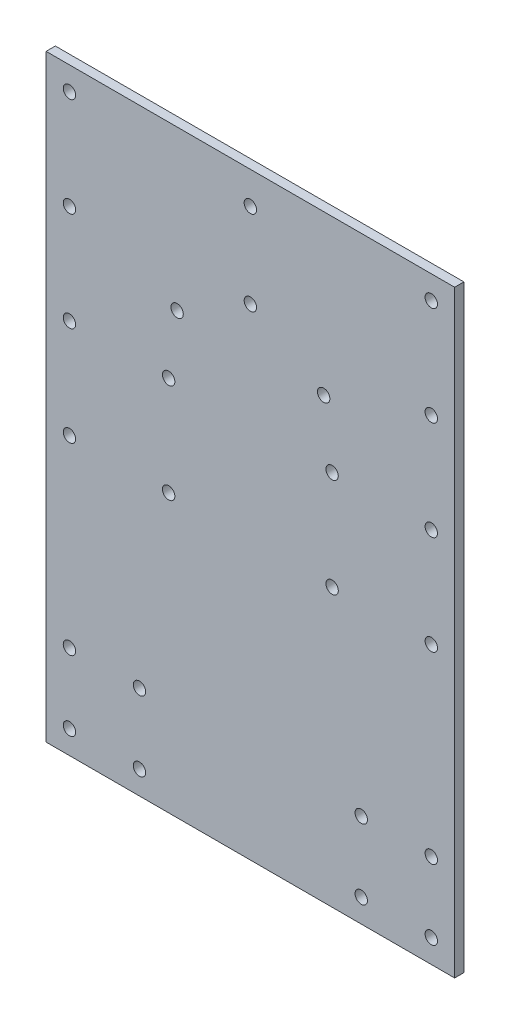
ISO-10303-21;
HEADER;
FILE_DESCRIPTION(('STEP AP214'),'2;1');
FILE_NAME('part.step','',(''),(''),'','','');
FILE_SCHEMA(('AUTOMOTIVE_DESIGN { 1 0 10303 214 1 1 1 1 }'));
ENDSEC;
DATA;
#1=APPLICATION_CONTEXT('core data for automotive mechanical design processes');
#2=APPLICATION_PROTOCOL_DEFINITION('international standard','automotive_design',2000,#1);
#3=PRODUCT_CONTEXT('',#1,'mechanical');
#4=PRODUCT('Part','Part','',(#3));
#5=PRODUCT_RELATED_PRODUCT_CATEGORY('part','',(#4));
#6=PRODUCT_DEFINITION_FORMATION('','',#4);
#7=PRODUCT_DEFINITION_CONTEXT('part definition',#1,'design');
#8=PRODUCT_DEFINITION('design','',#6,#7);
#9=PRODUCT_DEFINITION_SHAPE('','',#8);
#10=(LENGTH_UNIT() NAMED_UNIT(*) SI_UNIT(.MILLI.,.METRE.));
#11=(NAMED_UNIT(*) PLANE_ANGLE_UNIT() SI_UNIT($,.RADIAN.));
#12=(NAMED_UNIT(*) SI_UNIT($,.STERADIAN.) SOLID_ANGLE_UNIT());
#13=UNCERTAINTY_MEASURE_WITH_UNIT(LENGTH_MEASURE(1.E-05),#10,'distance_accuracy_value','');
#14=(GEOMETRIC_REPRESENTATION_CONTEXT(3) GLOBAL_UNCERTAINTY_ASSIGNED_CONTEXT((#13)) GLOBAL_UNIT_ASSIGNED_CONTEXT((#10,
#11,#12)) REPRESENTATION_CONTEXT('',''));
#15=CARTESIAN_POINT('',(0.,0.,0.));
#16=DIRECTION('',(0.,0.,1.));
#17=DIRECTION('',(1.,0.,0.));
#18=AXIS2_PLACEMENT_3D('',#15,#16,#17);
#19=CARTESIAN_POINT('',(0.,0.,3.175));
#20=DIRECTION('',(0.,0.,-1.));
#21=DIRECTION('',(-1.,0.,0.));
#22=AXIS2_PLACEMENT_3D('',#19,#20,#21);
#23=PLANE('',#22);
#24=CARTESIAN_POINT('',(-27.999999999999,-7.50000000000001,3.175));
#25=DIRECTION('',(0.,0.,1.));
#26=DIRECTION('',(1.,0.,0.));
#27=AXIS2_PLACEMENT_3D('',#24,#25,#26);
#28=CIRCLE('',#27,2.125);
#29=CARTESIAN_POINT('',(-25.874999999999,-7.50000000000001,3.175));
#30=VERTEX_POINT('',#29);
#31=EDGE_CURVE('E261',#30,#30,#28,.T.);
#32=ORIENTED_EDGE('',*,*,#31,.F.);
#33=EDGE_LOOP('',(#32));
#34=FACE_BOUND('',#33,.T.);
#35=CARTESIAN_POINT('',(27.9999999999971,-7.5,3.175));
#36=DIRECTION('',(0.,0.,1.));
#37=DIRECTION('',(-1.,0.,0.));
#38=AXIS2_PLACEMENT_3D('',#35,#36,#37);
#39=CIRCLE('',#38,2.125);
#40=CARTESIAN_POINT('',(25.8749999999971,-7.5,3.175));
#41=VERTEX_POINT('',#40);
#42=EDGE_CURVE('E276',#41,#41,#39,.T.);
#43=ORIENTED_EDGE('',*,*,#42,.F.);
#44=EDGE_LOOP('',(#43));
#45=FACE_BOUND('',#44,.T.);
#46=CARTESIAN_POINT('',(27.9999999999974,26.5,3.175));
#47=DIRECTION('',(0.,0.,1.));
#48=DIRECTION('',(-1.,0.,0.));
#49=AXIS2_PLACEMENT_3D('',#46,#47,#48);
#50=CIRCLE('',#49,2.125);
#51=CARTESIAN_POINT('',(25.8749999999974,26.5,3.175));
#52=VERTEX_POINT('',#51);
#53=EDGE_CURVE('E277',#52,#52,#50,.T.);
#54=ORIENTED_EDGE('',*,*,#53,.F.);
#55=EDGE_LOOP('',(#54));
#56=FACE_BOUND('',#55,.T.);
#57=CARTESIAN_POINT('',(61.9999999999971,-7.49999999999999,3.175));
#58=DIRECTION('',(0.,0.,1.));
#59=DIRECTION('',(-1.,0.,0.));
#60=AXIS2_PLACEMENT_3D('',#57,#58,#59);
#61=CIRCLE('',#60,2.125);
#62=CARTESIAN_POINT('',(59.8749999999971,-7.49999999999999,3.175));
#63=VERTEX_POINT('',#62);
#64=EDGE_CURVE('E292',#63,#63,#61,.T.);
#65=ORIENTED_EDGE('',*,*,#64,.F.);
#66=EDGE_LOOP('',(#65));
#67=FACE_BOUND('',#66,.T.);
#68=CARTESIAN_POINT('',(-61.9999999999997,60.5,3.175));
#69=DIRECTION('',(0.,0.,1.));
#70=DIRECTION('',(1.,0.,0.));
#71=AXIS2_PLACEMENT_3D('',#68,#69,#70);
#72=CIRCLE('',#71,2.125);
#73=CARTESIAN_POINT('',(-59.8749999999997,60.5,3.175));
#74=VERTEX_POINT('',#73);
#75=EDGE_CURVE('E236',#74,#74,#72,.T.);
#76=ORIENTED_EDGE('',*,*,#75,.F.);
#77=EDGE_LOOP('',(#76));
#78=FACE_BOUND('',#77,.T.);
#79=CARTESIAN_POINT('',(-61.9999999999993,26.5,3.175));
#80=DIRECTION('',(0.,0.,1.));
#81=DIRECTION('',(1.,0.,0.));
#82=AXIS2_PLACEMENT_3D('',#79,#80,#81);
#83=CIRCLE('',#82,2.125);
#84=CARTESIAN_POINT('',(-59.8749999999993,26.5,3.175));
#85=VERTEX_POINT('',#84);
#86=EDGE_CURVE('E244',#85,#85,#83,.T.);
#87=ORIENTED_EDGE('',*,*,#86,.F.);
#88=EDGE_LOOP('',(#87));
#89=FACE_BOUND('',#88,.T.);
#90=CARTESIAN_POINT('',(-61.999999999999,-7.50000000000001,3.175));
#91=DIRECTION('',(0.,0.,1.));
#92=DIRECTION('',(1.,0.,0.));
#93=AXIS2_PLACEMENT_3D('',#90,#91,#92);
#94=CIRCLE('',#93,2.125);
#95=CARTESIAN_POINT('',(-59.874999999999,-7.50000000000001,3.175));
#96=VERTEX_POINT('',#95);
#97=EDGE_CURVE('E245',#96,#96,#94,.T.);
#98=ORIENTED_EDGE('',*,*,#97,.F.);
#99=EDGE_LOOP('',(#98));
#100=FACE_BOUND('',#99,.T.);
#101=CARTESIAN_POINT('',(-27.9999999999993,26.5,3.175));
#102=DIRECTION('',(0.,0.,1.));
#103=DIRECTION('',(1.,0.,0.));
#104=AXIS2_PLACEMENT_3D('',#101,#102,#103);
#105=CIRCLE('',#104,2.125);
#106=CARTESIAN_POINT('',(-25.8749999999993,26.5,3.175));
#107=VERTEX_POINT('',#106);
#108=EDGE_CURVE('E260',#107,#107,#105,.T.);
#109=ORIENTED_EDGE('',*,*,#108,.F.);
#110=EDGE_LOOP('',(#109));
#111=FACE_BOUND('',#110,.T.);
#112=CARTESIAN_POINT('',(61.9999999999974,26.5,3.175));
#113=DIRECTION('',(0.,0.,1.));
#114=DIRECTION('',(-1.,0.,0.));
#115=AXIS2_PLACEMENT_3D('',#112,#113,#114);
#116=CIRCLE('',#115,2.12500000000001);
#117=CARTESIAN_POINT('',(59.8749999999974,26.5,3.175));
#118=VERTEX_POINT('',#117);
#119=EDGE_CURVE('E293',#118,#118,#116,.T.);
#120=ORIENTED_EDGE('',*,*,#119,.F.);
#121=EDGE_LOOP('',(#120));
#122=FACE_BOUND('',#121,.T.);
#123=CARTESIAN_POINT('',(61.9999999999978,60.5,3.175));
#124=DIRECTION('',(0.,0.,1.));
#125=DIRECTION('',(-1.,0.,0.));
#126=AXIS2_PLACEMENT_3D('',#123,#124,#125);
#127=CIRCLE('',#126,2.125);
#128=CARTESIAN_POINT('',(59.8749999999977,60.5,3.175));
#129=VERTEX_POINT('',#128);
#130=EDGE_CURVE('E316',#129,#129,#127,.T.);
#131=ORIENTED_EDGE('',*,*,#130,.F.);
#132=EDGE_LOOP('',(#131));
#133=FACE_BOUND('',#132,.T.);
#134=CARTESIAN_POINT('',(61.9999999999981,94.5,3.175));
#135=DIRECTION('',(0.,0.,1.));
#136=DIRECTION('',(-1.,0.,0.));
#137=AXIS2_PLACEMENT_3D('',#134,#135,#136);
#138=CIRCLE('',#137,2.12500000000001);
#139=CARTESIAN_POINT('',(59.8749999999981,94.5,3.175));
#140=VERTEX_POINT('',#139);
#141=EDGE_CURVE('E308',#140,#140,#138,.T.);
#142=ORIENTED_EDGE('',*,*,#141,.F.);
#143=EDGE_LOOP('',(#142));
#144=FACE_BOUND('',#143,.T.);
#145=CARTESIAN_POINT('',(-62.,94.5,3.175));
#146=DIRECTION('',(0.,0.,1.));
#147=DIRECTION('',(1.,0.,0.));
#148=AXIS2_PLACEMENT_3D('',#145,#146,#147);
#149=CIRCLE('',#148,2.125);
#150=CARTESIAN_POINT('',(-59.875,94.5,3.175));
#151=VERTEX_POINT('',#150);
#152=EDGE_CURVE('E232',#151,#151,#149,.T.);
#153=ORIENTED_EDGE('',*,*,#152,.F.);
#154=EDGE_LOOP('',(#153));
#155=FACE_BOUND('',#154,.T.);
#156=DIRECTION('',(0.,1.,0.));
#157=VECTOR('',#156,1.);
#158=CARTESIAN_POINT('',(70.,-102.5,3.175));
#159=LINE('',#158,#157);
#160=CARTESIAN_POINT('',(70.,-102.5,3.175));
#161=VERTEX_POINT('',#160);
#162=CARTESIAN_POINT('',(70.,102.5,3.175));
#163=VERTEX_POINT('',#162);
#164=EDGE_CURVE('E98',#161,#163,#159,.T.);
#165=ORIENTED_EDGE('',*,*,#164,.T.);
#166=DIRECTION('',(-1.,0.,0.));
#167=VECTOR('',#166,1.);
#168=CARTESIAN_POINT('',(-70.,102.5,3.175));
#169=LINE('',#168,#167);
#170=CARTESIAN_POINT('',(-70.,102.5,3.175));
#171=VERTEX_POINT('',#170);
#172=EDGE_CURVE('E93',#163,#171,#169,.T.);
#173=ORIENTED_EDGE('',*,*,#172,.T.);
#174=DIRECTION('',(0.,-1.,0.));
#175=VECTOR('',#174,1.);
#176=CARTESIAN_POINT('',(-70.,-102.5,3.175));
#177=LINE('',#176,#175);
#178=CARTESIAN_POINT('',(-70.,-102.5,3.175));
#179=VERTEX_POINT('',#178);
#180=EDGE_CURVE('E96',#171,#179,#177,.T.);
#181=ORIENTED_EDGE('',*,*,#180,.T.);
#182=DIRECTION('',(1.,0.,0.));
#183=VECTOR('',#182,1.);
#184=CARTESIAN_POINT('',(-70.,-102.5,3.175));
#185=LINE('',#184,#183);
#186=EDGE_CURVE('E63',#179,#161,#185,.T.);
#187=ORIENTED_EDGE('',*,*,#186,.T.);
#188=EDGE_LOOP('',(#165,#173,#181,#187));
#189=FACE_BOUND('',#188,.T.);
#190=CARTESIAN_POINT('',(0.,91.5,3.175));
#191=DIRECTION('',(0.,0.,1.));
#192=DIRECTION('',(1.,0.,0.));
#193=AXIS2_PLACEMENT_3D('',#190,#191,#192);
#194=CIRCLE('',#193,2.125);
#195=CARTESIAN_POINT('',(2.125,91.5,3.175));
#196=VERTEX_POINT('',#195);
#197=EDGE_CURVE('E118',#196,#196,#194,.T.);
#198=ORIENTED_EDGE('',*,*,#197,.F.);
#199=EDGE_LOOP('',(#198));
#200=FACE_BOUND('',#199,.T.);
#201=CARTESIAN_POINT('',(-62.,-94.5,3.175));
#202=DIRECTION('',(0.,0.,1.));
#203=DIRECTION('',(1.,0.,0.));
#204=AXIS2_PLACEMENT_3D('',#201,#202,#203);
#205=CIRCLE('',#204,2.125);
#206=CARTESIAN_POINT('',(-59.875,-94.5,3.175));
#207=VERTEX_POINT('',#206);
#208=EDGE_CURVE('E140',#207,#207,#205,.T.);
#209=ORIENTED_EDGE('',*,*,#208,.F.);
#210=EDGE_LOOP('',(#209));
#211=FACE_BOUND('',#210,.T.);
#212=CARTESIAN_POINT('',(25.1147367097487,48.,3.175));
#213=DIRECTION('',(0.,0.,1.));
#214=DIRECTION('',(1.,0.,0.));
#215=AXIS2_PLACEMENT_3D('',#212,#213,#214);
#216=CIRCLE('',#215,2.125);
#217=CARTESIAN_POINT('',(27.2397367097487,48.,3.175));
#218=VERTEX_POINT('',#217);
#219=EDGE_CURVE('E148',#218,#218,#216,.T.);
#220=ORIENTED_EDGE('',*,*,#219,.F.);
#221=EDGE_LOOP('',(#220));
#222=FACE_BOUND('',#221,.T.);
#223=CARTESIAN_POINT('',(-25.1147367097487,48.,3.175));
#224=DIRECTION('',(0.,0.,1.));
#225=DIRECTION('',(1.,0.,0.));
#226=AXIS2_PLACEMENT_3D('',#223,#224,#225);
#227=CIRCLE('',#226,2.125);
#228=CARTESIAN_POINT('',(-22.9897367097487,48.,3.175));
#229=VERTEX_POINT('',#228);
#230=EDGE_CURVE('E156',#229,#229,#227,.T.);
#231=ORIENTED_EDGE('',*,*,#230,.F.);
#232=EDGE_LOOP('',(#231));
#233=FACE_BOUND('',#232,.T.);
#234=CARTESIAN_POINT('',(-38.,-94.5,3.175));
#235=DIRECTION('',(0.,0.,1.));
#236=DIRECTION('',(-1.,0.,0.));
#237=AXIS2_PLACEMENT_3D('',#234,#235,#236);
#238=CIRCLE('',#237,2.125);
#239=CARTESIAN_POINT('',(-40.125,-94.5,3.175));
#240=VERTEX_POINT('',#239);
#241=EDGE_CURVE('E164',#240,#240,#238,.T.);
#242=ORIENTED_EDGE('',*,*,#241,.F.);
#243=EDGE_LOOP('',(#242));
#244=FACE_BOUND('',#243,.T.);
#245=CARTESIAN_POINT('',(-38.,-70.5,3.175));
#246=DIRECTION('',(0.,0.,1.));
#247=DIRECTION('',(1.,0.,0.));
#248=AXIS2_PLACEMENT_3D('',#245,#246,#247);
#249=CIRCLE('',#248,2.125);
#250=CARTESIAN_POINT('',(-35.875,-70.5,3.175));
#251=VERTEX_POINT('',#250);
#252=EDGE_CURVE('E172',#251,#251,#249,.T.);
#253=ORIENTED_EDGE('',*,*,#252,.F.);
#254=EDGE_LOOP('',(#253));
#255=FACE_BOUND('',#254,.T.);
#256=CARTESIAN_POINT('',(-62.,-70.5,3.175));
#257=DIRECTION('',(0.,0.,1.));
#258=DIRECTION('',(-1.,0.,0.));
#259=AXIS2_PLACEMENT_3D('',#256,#257,#258);
#260=CIRCLE('',#259,2.125);
#261=CARTESIAN_POINT('',(-64.125,-70.5,3.175));
#262=VERTEX_POINT('',#261);
#263=EDGE_CURVE('E180',#262,#262,#260,.T.);
#264=ORIENTED_EDGE('',*,*,#263,.F.);
#265=EDGE_LOOP('',(#264));
#266=FACE_BOUND('',#265,.T.);
#267=CARTESIAN_POINT('',(38.0000000000001,-94.5,3.175));
#268=DIRECTION('',(0.,0.,1.));
#269=DIRECTION('',(1.,0.,0.));
#270=AXIS2_PLACEMENT_3D('',#267,#268,#269);
#271=CIRCLE('',#270,2.125);
#272=CARTESIAN_POINT('',(40.1250000000001,-94.5,3.175));
#273=VERTEX_POINT('',#272);
#274=EDGE_CURVE('E188',#273,#273,#271,.T.);
#275=ORIENTED_EDGE('',*,*,#274,.F.);
#276=EDGE_LOOP('',(#275));
#277=FACE_BOUND('',#276,.T.);
#278=CARTESIAN_POINT('',(62.0000000000001,-94.5,3.175));
#279=DIRECTION('',(0.,0.,1.));
#280=DIRECTION('',(-1.,0.,0.));
#281=AXIS2_PLACEMENT_3D('',#278,#279,#280);
#282=CIRCLE('',#281,2.12500000000001);
#283=CARTESIAN_POINT('',(59.875,-94.5,3.175));
#284=VERTEX_POINT('',#283);
#285=EDGE_CURVE('E196',#284,#284,#282,.T.);
#286=ORIENTED_EDGE('',*,*,#285,.F.);
#287=EDGE_LOOP('',(#286));
#288=FACE_BOUND('',#287,.T.);
#289=CARTESIAN_POINT('',(62.0000000000001,-70.5,3.175));
#290=DIRECTION('',(0.,0.,1.));
#291=DIRECTION('',(1.,0.,0.));
#292=AXIS2_PLACEMENT_3D('',#289,#290,#291);
#293=CIRCLE('',#292,2.12500000000001);
#294=CARTESIAN_POINT('',(64.1250000000001,-70.5,3.175));
#295=VERTEX_POINT('',#294);
#296=EDGE_CURVE('E204',#295,#295,#293,.T.);
#297=ORIENTED_EDGE('',*,*,#296,.F.);
#298=EDGE_LOOP('',(#297));
#299=FACE_BOUND('',#298,.T.);
#300=CARTESIAN_POINT('',(38.0000000000001,-70.5,3.175));
#301=DIRECTION('',(0.,0.,1.));
#302=DIRECTION('',(-1.,0.,0.));
#303=AXIS2_PLACEMENT_3D('',#300,#301,#302);
#304=CIRCLE('',#303,2.125);
#305=CARTESIAN_POINT('',(35.8750000000001,-70.5,3.175));
#306=VERTEX_POINT('',#305);
#307=EDGE_CURVE('E212',#306,#306,#304,.T.);
#308=ORIENTED_EDGE('',*,*,#307,.F.);
#309=EDGE_LOOP('',(#308));
#310=FACE_BOUND('',#309,.T.);
#311=CARTESIAN_POINT('',(0.,62.5,3.175));
#312=DIRECTION('',(0.,0.,1.));
#313=DIRECTION('',(1.,0.,0.));
#314=AXIS2_PLACEMENT_3D('',#311,#312,#313);
#315=CIRCLE('',#314,2.125);
#316=CARTESIAN_POINT('',(2.125,62.5,3.175));
#317=VERTEX_POINT('',#316);
#318=EDGE_CURVE('E220',#317,#317,#315,.T.);
#319=ORIENTED_EDGE('',*,*,#318,.F.);
#320=EDGE_LOOP('',(#319));
#321=FACE_BOUND('',#320,.T.);
#322=ADVANCED_FACE('F45',(#34,#45,#56,#67,#78,#89,#100,#111,#122,#133,#144,#155,#189,#200,#211,
#222,#233,#244,#255,#266,#277,#288,#299,#310,#321),#23,.F.);
#323=CARTESIAN_POINT('',(0.,0.,0.));
#324=DIRECTION('',(0.,0.,-1.));
#325=DIRECTION('',(-1.,0.,0.));
#326=AXIS2_PLACEMENT_3D('',#323,#324,#325);
#327=PLANE('',#326);
#328=CARTESIAN_POINT('',(-27.999999999999,-7.50000000000001,0.));
#329=DIRECTION('',(0.,0.,1.));
#330=DIRECTION('',(1.,0.,0.));
#331=AXIS2_PLACEMENT_3D('',#328,#329,#330);
#332=CIRCLE('',#331,2.125);
#333=CARTESIAN_POINT('',(-25.874999999999,-7.50000000000001,0.));
#334=VERTEX_POINT('',#333);
#335=EDGE_CURVE('E281',#334,#334,#332,.T.);
#336=ORIENTED_EDGE('',*,*,#335,.T.);
#337=EDGE_LOOP('',(#336));
#338=FACE_BOUND('',#337,.T.);
#339=CARTESIAN_POINT('',(27.9999999999971,-7.5,0.));
#340=DIRECTION('',(0.,0.,1.));
#341=DIRECTION('',(-1.,0.,0.));
#342=AXIS2_PLACEMENT_3D('',#339,#340,#341);
#343=CIRCLE('',#342,2.125);
#344=CARTESIAN_POINT('',(25.8749999999971,-7.5,0.));
#345=VERTEX_POINT('',#344);
#346=EDGE_CURVE('E272',#345,#345,#343,.T.);
#347=ORIENTED_EDGE('',*,*,#346,.T.);
#348=EDGE_LOOP('',(#347));
#349=FACE_BOUND('',#348,.T.);
#350=CARTESIAN_POINT('',(27.9999999999974,26.5,0.));
#351=DIRECTION('',(0.,0.,1.));
#352=DIRECTION('',(-1.,0.,0.));
#353=AXIS2_PLACEMENT_3D('',#350,#351,#352);
#354=CIRCLE('',#353,2.125);
#355=CARTESIAN_POINT('',(25.8749999999974,26.5,0.));
#356=VERTEX_POINT('',#355);
#357=EDGE_CURVE('E297',#356,#356,#354,.T.);
#358=ORIENTED_EDGE('',*,*,#357,.T.);
#359=EDGE_LOOP('',(#358));
#360=FACE_BOUND('',#359,.T.);
#361=CARTESIAN_POINT('',(61.9999999999971,-7.49999999999999,0.));
#362=DIRECTION('',(0.,0.,1.));
#363=DIRECTION('',(-1.,0.,0.));
#364=AXIS2_PLACEMENT_3D('',#361,#362,#363);
#365=CIRCLE('',#364,2.125);
#366=CARTESIAN_POINT('',(59.8749999999971,-7.49999999999999,0.));
#367=VERTEX_POINT('',#366);
#368=EDGE_CURVE('E288',#367,#367,#365,.T.);
#369=ORIENTED_EDGE('',*,*,#368,.T.);
#370=EDGE_LOOP('',(#369));
#371=FACE_BOUND('',#370,.T.);
#372=CARTESIAN_POINT('',(-61.9999999999997,60.5,0.));
#373=DIRECTION('',(0.,0.,1.));
#374=DIRECTION('',(1.,0.,0.));
#375=AXIS2_PLACEMENT_3D('',#372,#373,#374);
#376=CIRCLE('',#375,2.125);
#377=CARTESIAN_POINT('',(-59.8749999999997,60.5,0.));
#378=VERTEX_POINT('',#377);
#379=EDGE_CURVE('E249',#378,#378,#376,.T.);
#380=ORIENTED_EDGE('',*,*,#379,.T.);
#381=EDGE_LOOP('',(#380));
#382=FACE_BOUND('',#381,.T.);
#383=CARTESIAN_POINT('',(-61.9999999999993,26.5,0.));
#384=DIRECTION('',(0.,0.,1.));
#385=DIRECTION('',(1.,0.,0.));
#386=AXIS2_PLACEMENT_3D('',#383,#384,#385);
#387=CIRCLE('',#386,2.125);
#388=CARTESIAN_POINT('',(-59.8749999999993,26.5,0.));
#389=VERTEX_POINT('',#388);
#390=EDGE_CURVE('E240',#389,#389,#387,.T.);
#391=ORIENTED_EDGE('',*,*,#390,.T.);
#392=EDGE_LOOP('',(#391));
#393=FACE_BOUND('',#392,.T.);
#394=CARTESIAN_POINT('',(-61.999999999999,-7.50000000000001,0.));
#395=DIRECTION('',(0.,0.,1.));
#396=DIRECTION('',(1.,0.,0.));
#397=AXIS2_PLACEMENT_3D('',#394,#395,#396);
#398=CIRCLE('',#397,2.125);
#399=CARTESIAN_POINT('',(-59.874999999999,-7.50000000000001,0.));
#400=VERTEX_POINT('',#399);
#401=EDGE_CURVE('E265',#400,#400,#398,.T.);
#402=ORIENTED_EDGE('',*,*,#401,.T.);
#403=EDGE_LOOP('',(#402));
#404=FACE_BOUND('',#403,.T.);
#405=CARTESIAN_POINT('',(-27.9999999999993,26.5,0.));
#406=DIRECTION('',(0.,0.,1.));
#407=DIRECTION('',(1.,0.,0.));
#408=AXIS2_PLACEMENT_3D('',#405,#406,#407);
#409=CIRCLE('',#408,2.125);
#410=CARTESIAN_POINT('',(-25.8749999999993,26.5,0.));
#411=VERTEX_POINT('',#410);
#412=EDGE_CURVE('E256',#411,#411,#409,.T.);
#413=ORIENTED_EDGE('',*,*,#412,.T.);
#414=EDGE_LOOP('',(#413));
#415=FACE_BOUND('',#414,.T.);
#416=CARTESIAN_POINT('',(61.9999999999974,26.5,0.));
#417=DIRECTION('',(0.,0.,1.));
#418=DIRECTION('',(-1.,0.,0.));
#419=AXIS2_PLACEMENT_3D('',#416,#417,#418);
#420=CIRCLE('',#419,2.12500000000001);
#421=CARTESIAN_POINT('',(59.8749999999974,26.5,0.));
#422=VERTEX_POINT('',#421);
#423=EDGE_CURVE('E320',#422,#422,#420,.T.);
#424=ORIENTED_EDGE('',*,*,#423,.T.);
#425=EDGE_LOOP('',(#424));
#426=FACE_BOUND('',#425,.T.);
#427=CARTESIAN_POINT('',(61.9999999999978,60.5,0.));
#428=DIRECTION('',(0.,0.,1.));
#429=DIRECTION('',(-1.,0.,0.));
#430=AXIS2_PLACEMENT_3D('',#427,#428,#429);
#431=CIRCLE('',#430,2.125);
#432=CARTESIAN_POINT('',(59.8749999999977,60.5,0.));
#433=VERTEX_POINT('',#432);
#434=EDGE_CURVE('E312',#433,#433,#431,.T.);
#435=ORIENTED_EDGE('',*,*,#434,.T.);
#436=EDGE_LOOP('',(#435));
#437=FACE_BOUND('',#436,.T.);
#438=CARTESIAN_POINT('',(61.9999999999981,94.5,0.));
#439=DIRECTION('',(0.,0.,1.));
#440=DIRECTION('',(-1.,0.,0.));
#441=AXIS2_PLACEMENT_3D('',#438,#439,#440);
#442=CIRCLE('',#441,2.12500000000001);
#443=CARTESIAN_POINT('',(59.8749999999981,94.5,0.));
#444=VERTEX_POINT('',#443);
#445=EDGE_CURVE('E304',#444,#444,#442,.T.);
#446=ORIENTED_EDGE('',*,*,#445,.T.);
#447=EDGE_LOOP('',(#446));
#448=FACE_BOUND('',#447,.T.);
#449=CARTESIAN_POINT('',(-62.,94.5,0.));
#450=DIRECTION('',(0.,0.,1.));
#451=DIRECTION('',(1.,0.,0.));
#452=AXIS2_PLACEMENT_3D('',#449,#450,#451);
#453=CIRCLE('',#452,2.125);
#454=CARTESIAN_POINT('',(-59.875,94.5,0.));
#455=VERTEX_POINT('',#454);
#456=EDGE_CURVE('E228',#455,#455,#453,.T.);
#457=ORIENTED_EDGE('',*,*,#456,.T.);
#458=EDGE_LOOP('',(#457));
#459=FACE_BOUND('',#458,.T.);
#460=CARTESIAN_POINT('',(38.0000000000001,-70.5,0.));
#461=DIRECTION('',(0.,0.,1.));
#462=DIRECTION('',(-1.,0.,0.));
#463=AXIS2_PLACEMENT_3D('',#460,#461,#462);
#464=CIRCLE('',#463,2.125);
#465=CARTESIAN_POINT('',(35.8750000000001,-70.5,0.));
#466=VERTEX_POINT('',#465);
#467=EDGE_CURVE('E216',#466,#466,#464,.T.);
#468=ORIENTED_EDGE('',*,*,#467,.T.);
#469=EDGE_LOOP('',(#468));
#470=FACE_BOUND('',#469,.T.);
#471=CARTESIAN_POINT('',(62.0000000000001,-94.5,0.));
#472=DIRECTION('',(0.,0.,1.));
#473=DIRECTION('',(-1.,0.,0.));
#474=AXIS2_PLACEMENT_3D('',#471,#472,#473);
#475=CIRCLE('',#474,2.12500000000001);
#476=CARTESIAN_POINT('',(59.875,-94.5,0.));
#477=VERTEX_POINT('',#476);
#478=EDGE_CURVE('E200',#477,#477,#475,.T.);
#479=ORIENTED_EDGE('',*,*,#478,.T.);
#480=EDGE_LOOP('',(#479));
#481=FACE_BOUND('',#480,.T.);
#482=CARTESIAN_POINT('',(-62.,-70.5,0.));
#483=DIRECTION('',(0.,0.,1.));
#484=DIRECTION('',(-1.,0.,0.));
#485=AXIS2_PLACEMENT_3D('',#482,#483,#484);
#486=CIRCLE('',#485,2.125);
#487=CARTESIAN_POINT('',(-64.125,-70.5,0.));
#488=VERTEX_POINT('',#487);
#489=EDGE_CURVE('E184',#488,#488,#486,.T.);
#490=ORIENTED_EDGE('',*,*,#489,.T.);
#491=EDGE_LOOP('',(#490));
#492=FACE_BOUND('',#491,.T.);
#493=CARTESIAN_POINT('',(-38.,-94.5,0.));
#494=DIRECTION('',(0.,0.,1.));
#495=DIRECTION('',(-1.,0.,0.));
#496=AXIS2_PLACEMENT_3D('',#493,#494,#495);
#497=CIRCLE('',#496,2.125);
#498=CARTESIAN_POINT('',(-40.125,-94.5,0.));
#499=VERTEX_POINT('',#498);
#500=EDGE_CURVE('E168',#499,#499,#497,.T.);
#501=ORIENTED_EDGE('',*,*,#500,.T.);
#502=EDGE_LOOP('',(#501));
#503=FACE_BOUND('',#502,.T.);
#504=CARTESIAN_POINT('',(25.1147367097487,48.,0.));
#505=DIRECTION('',(0.,0.,1.));
#506=DIRECTION('',(1.,0.,0.));
#507=AXIS2_PLACEMENT_3D('',#504,#505,#506);
#508=CIRCLE('',#507,2.125);
#509=CARTESIAN_POINT('',(27.2397367097487,48.,0.));
#510=VERTEX_POINT('',#509);
#511=EDGE_CURVE('E152',#510,#510,#508,.T.);
#512=ORIENTED_EDGE('',*,*,#511,.T.);
#513=EDGE_LOOP('',(#512));
#514=FACE_BOUND('',#513,.T.);
#515=CARTESIAN_POINT('',(0.,91.5,0.));
#516=DIRECTION('',(0.,0.,1.));
#517=DIRECTION('',(1.,0.,0.));
#518=AXIS2_PLACEMENT_3D('',#515,#516,#517);
#519=CIRCLE('',#518,2.125);
#520=CARTESIAN_POINT('',(2.125,91.5,0.));
#521=VERTEX_POINT('',#520);
#522=EDGE_CURVE('E136',#521,#521,#519,.T.);
#523=ORIENTED_EDGE('',*,*,#522,.T.);
#524=EDGE_LOOP('',(#523));
#525=FACE_BOUND('',#524,.T.);
#526=DIRECTION('',(0.,1.,0.));
#527=VECTOR('',#526,1.);
#528=CARTESIAN_POINT('',(70.,-102.5,0.));
#529=LINE('',#528,#527);
#530=CARTESIAN_POINT('',(70.,-102.5,0.));
#531=VERTEX_POINT('',#530);
#532=CARTESIAN_POINT('',(70.,102.5,0.));
#533=VERTEX_POINT('',#532);
#534=EDGE_CURVE('E114',#531,#533,#529,.T.);
#535=ORIENTED_EDGE('',*,*,#534,.F.);
#536=DIRECTION('',(1.,0.,0.));
#537=VECTOR('',#536,1.);
#538=CARTESIAN_POINT('',(-70.,-102.5,0.));
#539=LINE('',#538,#537);
#540=CARTESIAN_POINT('',(-70.,-102.5,0.));
#541=VERTEX_POINT('',#540);
#542=EDGE_CURVE('E86',#541,#531,#539,.T.);
#543=ORIENTED_EDGE('',*,*,#542,.F.);
#544=DIRECTION('',(0.,-1.,0.));
#545=VECTOR('',#544,1.);
#546=CARTESIAN_POINT('',(-70.,-102.5,0.));
#547=LINE('',#546,#545);
#548=CARTESIAN_POINT('',(-70.,102.5,0.));
#549=VERTEX_POINT('',#548);
#550=EDGE_CURVE('E80',#549,#541,#547,.T.);
#551=ORIENTED_EDGE('',*,*,#550,.F.);
#552=DIRECTION('',(-1.,0.,0.));
#553=VECTOR('',#552,1.);
#554=CARTESIAN_POINT('',(-70.,102.5,0.));
#555=LINE('',#554,#553);
#556=EDGE_CURVE('E103',#533,#549,#555,.T.);
#557=ORIENTED_EDGE('',*,*,#556,.F.);
#558=EDGE_LOOP('',(#535,#543,#551,#557));
#559=FACE_BOUND('',#558,.T.);
#560=CARTESIAN_POINT('',(-62.,-94.5,0.));
#561=DIRECTION('',(0.,0.,1.));
#562=DIRECTION('',(1.,0.,0.));
#563=AXIS2_PLACEMENT_3D('',#560,#561,#562);
#564=CIRCLE('',#563,2.125);
#565=CARTESIAN_POINT('',(-59.875,-94.5,0.));
#566=VERTEX_POINT('',#565);
#567=EDGE_CURVE('E144',#566,#566,#564,.T.);
#568=ORIENTED_EDGE('',*,*,#567,.T.);
#569=EDGE_LOOP('',(#568));
#570=FACE_BOUND('',#569,.T.);
#571=CARTESIAN_POINT('',(-25.1147367097487,48.,0.));
#572=DIRECTION('',(0.,0.,1.));
#573=DIRECTION('',(1.,0.,0.));
#574=AXIS2_PLACEMENT_3D('',#571,#572,#573);
#575=CIRCLE('',#574,2.125);
#576=CARTESIAN_POINT('',(-22.9897367097487,48.,0.));
#577=VERTEX_POINT('',#576);
#578=EDGE_CURVE('E160',#577,#577,#575,.T.);
#579=ORIENTED_EDGE('',*,*,#578,.T.);
#580=EDGE_LOOP('',(#579));
#581=FACE_BOUND('',#580,.T.);
#582=CARTESIAN_POINT('',(-38.,-70.5,0.));
#583=DIRECTION('',(0.,0.,1.));
#584=DIRECTION('',(1.,0.,0.));
#585=AXIS2_PLACEMENT_3D('',#582,#583,#584);
#586=CIRCLE('',#585,2.125);
#587=CARTESIAN_POINT('',(-35.875,-70.5,0.));
#588=VERTEX_POINT('',#587);
#589=EDGE_CURVE('E176',#588,#588,#586,.T.);
#590=ORIENTED_EDGE('',*,*,#589,.T.);
#591=EDGE_LOOP('',(#590));
#592=FACE_BOUND('',#591,.T.);
#593=CARTESIAN_POINT('',(38.0000000000001,-94.5,0.));
#594=DIRECTION('',(0.,0.,1.));
#595=DIRECTION('',(1.,0.,0.));
#596=AXIS2_PLACEMENT_3D('',#593,#594,#595);
#597=CIRCLE('',#596,2.125);
#598=CARTESIAN_POINT('',(40.1250000000001,-94.5,0.));
#599=VERTEX_POINT('',#598);
#600=EDGE_CURVE('E192',#599,#599,#597,.T.);
#601=ORIENTED_EDGE('',*,*,#600,.T.);
#602=EDGE_LOOP('',(#601));
#603=FACE_BOUND('',#602,.T.);
#604=CARTESIAN_POINT('',(62.0000000000001,-70.5,0.));
#605=DIRECTION('',(0.,0.,1.));
#606=DIRECTION('',(1.,0.,0.));
#607=AXIS2_PLACEMENT_3D('',#604,#605,#606);
#608=CIRCLE('',#607,2.12500000000001);
#609=CARTESIAN_POINT('',(64.1250000000001,-70.5,0.));
#610=VERTEX_POINT('',#609);
#611=EDGE_CURVE('E208',#610,#610,#608,.T.);
#612=ORIENTED_EDGE('',*,*,#611,.T.);
#613=EDGE_LOOP('',(#612));
#614=FACE_BOUND('',#613,.T.);
#615=CARTESIAN_POINT('',(0.,62.5,0.));
#616=DIRECTION('',(0.,0.,1.));
#617=DIRECTION('',(1.,0.,0.));
#618=AXIS2_PLACEMENT_3D('',#615,#616,#617);
#619=CIRCLE('',#618,2.125);
#620=CARTESIAN_POINT('',(2.125,62.5,0.));
#621=VERTEX_POINT('',#620);
#622=EDGE_CURVE('E224',#621,#621,#619,.T.);
#623=ORIENTED_EDGE('',*,*,#622,.T.);
#624=EDGE_LOOP('',(#623));
#625=FACE_BOUND('',#624,.T.);
#626=ADVANCED_FACE('F131',(#338,#349,#360,#371,#382,#393,#404,#415,#426,#437,#448,#459,#470,
#481,#492,#503,#514,#525,#559,#570,#581,#592,#603,#614,#625),#327,.T.);
#627=CARTESIAN_POINT('',(70.,-102.5,3.175));
#628=DIRECTION('',(-1.,0.,0.));
#629=DIRECTION('',(0.,-1.,0.));
#630=AXIS2_PLACEMENT_3D('',#627,#628,#629);
#631=PLANE('',#630);
#632=ORIENTED_EDGE('',*,*,#534,.T.);
#633=DIRECTION('',(0.,0.,-1.));
#634=VECTOR('',#633,1.);
#635=CARTESIAN_POINT('',(70.,102.5,3.175));
#636=LINE('',#635,#634);
#637=EDGE_CURVE('E11',#163,#533,#636,.T.);
#638=ORIENTED_EDGE('',*,*,#637,.F.);
#639=ORIENTED_EDGE('',*,*,#164,.F.);
#640=DIRECTION('',(0.,0.,-1.));
#641=VECTOR('',#640,1.);
#642=CARTESIAN_POINT('',(70.,-102.5,3.175));
#643=LINE('',#642,#641);
#644=EDGE_CURVE('E110',#161,#531,#643,.T.);
#645=ORIENTED_EDGE('',*,*,#644,.T.);
#646=EDGE_LOOP('',(#632,#638,#639,#645));
#647=FACE_BOUND('',#646,.T.);
#648=ADVANCED_FACE('F47',(#647),#631,.F.);
#649=CARTESIAN_POINT('',(-70.,102.5,3.175));
#650=DIRECTION('',(0.,-1.,0.));
#651=DIRECTION('',(1.,0.,0.));
#652=AXIS2_PLACEMENT_3D('',#649,#650,#651);
#653=PLANE('',#652);
#654=ORIENTED_EDGE('',*,*,#556,.T.);
#655=DIRECTION('',(0.,0.,-1.));
#656=VECTOR('',#655,1.);
#657=CARTESIAN_POINT('',(-70.,102.5,3.175));
#658=LINE('',#657,#656);
#659=EDGE_CURVE('E55',#171,#549,#658,.T.);
#660=ORIENTED_EDGE('',*,*,#659,.F.);
#661=ORIENTED_EDGE('',*,*,#172,.F.);
#662=ORIENTED_EDGE('',*,*,#637,.T.);
#663=EDGE_LOOP('',(#654,#660,#661,#662));
#664=FACE_BOUND('',#663,.T.);
#665=ADVANCED_FACE('F102',(#664),#653,.F.);
#666=CARTESIAN_POINT('',(-70.,-102.5,3.175));
#667=DIRECTION('',(1.,0.,0.));
#668=DIRECTION('',(0.,0.,-1.));
#669=AXIS2_PLACEMENT_3D('',#666,#667,#668);
#670=PLANE('',#669);
#671=ORIENTED_EDGE('',*,*,#550,.T.);
#672=DIRECTION('',(0.,0.,-1.));
#673=VECTOR('',#672,1.);
#674=CARTESIAN_POINT('',(-70.,-102.5,3.175));
#675=LINE('',#674,#673);
#676=EDGE_CURVE('E105',#179,#541,#675,.T.);
#677=ORIENTED_EDGE('',*,*,#676,.F.);
#678=ORIENTED_EDGE('',*,*,#180,.F.);
#679=ORIENTED_EDGE('',*,*,#659,.T.);
#680=EDGE_LOOP('',(#671,#677,#678,#679));
#681=FACE_BOUND('',#680,.T.);
#682=ADVANCED_FACE('F106',(#681),#670,.F.);
#683=CARTESIAN_POINT('',(-70.,-102.5,3.175));
#684=DIRECTION('',(0.,1.,0.));
#685=DIRECTION('',(-1.,0.,0.));
#686=AXIS2_PLACEMENT_3D('',#683,#684,#685);
#687=PLANE('',#686);
#688=ORIENTED_EDGE('',*,*,#542,.T.);
#689=ORIENTED_EDGE('',*,*,#644,.F.);
#690=ORIENTED_EDGE('',*,*,#186,.F.);
#691=ORIENTED_EDGE('',*,*,#676,.T.);
#692=EDGE_LOOP('',(#688,#689,#690,#691));
#693=FACE_BOUND('',#692,.T.);
#694=ADVANCED_FACE('F128',(#693),#687,.F.);
#695=CARTESIAN_POINT('',(0.,91.5,3.175));
#696=DIRECTION('',(0.,0.,-1.));
#697=DIRECTION('',(-1.,0.,0.));
#698=AXIS2_PLACEMENT_3D('',#695,#696,#697);
#699=CYLINDRICAL_SURFACE('',#698,2.125);
#700=ORIENTED_EDGE('',*,*,#197,.T.);
#701=EDGE_LOOP('',(#700));
#702=FACE_BOUND('',#701,.T.);
#703=ORIENTED_EDGE('',*,*,#522,.F.);
#704=EDGE_LOOP('',(#703));
#705=FACE_BOUND('',#704,.T.);
#706=ADVANCED_FACE('F400',(#702,#705),#699,.F.);
#707=CARTESIAN_POINT('',(-62.,-94.5,3.175));
#708=DIRECTION('',(0.,0.,-1.));
#709=DIRECTION('',(-1.,0.,0.));
#710=AXIS2_PLACEMENT_3D('',#707,#708,#709);
#711=CYLINDRICAL_SURFACE('',#710,2.125);
#712=ORIENTED_EDGE('',*,*,#208,.T.);
#713=EDGE_LOOP('',(#712));
#714=FACE_BOUND('',#713,.T.);
#715=ORIENTED_EDGE('',*,*,#567,.F.);
#716=EDGE_LOOP('',(#715));
#717=FACE_BOUND('',#716,.T.);
#718=ADVANCED_FACE('F396',(#714,#717),#711,.F.);
#719=CARTESIAN_POINT('',(25.1147367097487,48.,3.175));
#720=DIRECTION('',(0.,0.,-1.));
#721=DIRECTION('',(-1.,0.,0.));
#722=AXIS2_PLACEMENT_3D('',#719,#720,#721);
#723=CYLINDRICAL_SURFACE('',#722,2.125);
#724=ORIENTED_EDGE('',*,*,#219,.T.);
#725=EDGE_LOOP('',(#724));
#726=FACE_BOUND('',#725,.T.);
#727=ORIENTED_EDGE('',*,*,#511,.F.);
#728=EDGE_LOOP('',(#727));
#729=FACE_BOUND('',#728,.T.);
#730=ADVANCED_FACE('F392',(#726,#729),#723,.F.);
#731=CARTESIAN_POINT('',(-25.1147367097487,48.,3.175));
#732=DIRECTION('',(0.,0.,-1.));
#733=DIRECTION('',(-1.,0.,0.));
#734=AXIS2_PLACEMENT_3D('',#731,#732,#733);
#735=CYLINDRICAL_SURFACE('',#734,2.125);
#736=ORIENTED_EDGE('',*,*,#230,.T.);
#737=EDGE_LOOP('',(#736));
#738=FACE_BOUND('',#737,.T.);
#739=ORIENTED_EDGE('',*,*,#578,.F.);
#740=EDGE_LOOP('',(#739));
#741=FACE_BOUND('',#740,.T.);
#742=ADVANCED_FACE('F388',(#738,#741),#735,.F.);
#743=CARTESIAN_POINT('',(-38.,-94.5,3.175));
#744=DIRECTION('',(0.,0.,-1.));
#745=DIRECTION('',(-1.,0.,0.));
#746=AXIS2_PLACEMENT_3D('',#743,#744,#745);
#747=CYLINDRICAL_SURFACE('',#746,2.125);
#748=ORIENTED_EDGE('',*,*,#241,.T.);
#749=EDGE_LOOP('',(#748));
#750=FACE_BOUND('',#749,.T.);
#751=ORIENTED_EDGE('',*,*,#500,.F.);
#752=EDGE_LOOP('',(#751));
#753=FACE_BOUND('',#752,.T.);
#754=ADVANCED_FACE('F384',(#750,#753),#747,.F.);
#755=CARTESIAN_POINT('',(-38.,-70.5,3.175));
#756=DIRECTION('',(0.,0.,-1.));
#757=DIRECTION('',(-1.,0.,0.));
#758=AXIS2_PLACEMENT_3D('',#755,#756,#757);
#759=CYLINDRICAL_SURFACE('',#758,2.125);
#760=ORIENTED_EDGE('',*,*,#252,.T.);
#761=EDGE_LOOP('',(#760));
#762=FACE_BOUND('',#761,.T.);
#763=ORIENTED_EDGE('',*,*,#589,.F.);
#764=EDGE_LOOP('',(#763));
#765=FACE_BOUND('',#764,.T.);
#766=ADVANCED_FACE('F380',(#762,#765),#759,.F.);
#767=CARTESIAN_POINT('',(-62.,-70.5,3.175));
#768=DIRECTION('',(0.,0.,-1.));
#769=DIRECTION('',(-1.,0.,0.));
#770=AXIS2_PLACEMENT_3D('',#767,#768,#769);
#771=CYLINDRICAL_SURFACE('',#770,2.125);
#772=ORIENTED_EDGE('',*,*,#263,.T.);
#773=EDGE_LOOP('',(#772));
#774=FACE_BOUND('',#773,.T.);
#775=ORIENTED_EDGE('',*,*,#489,.F.);
#776=EDGE_LOOP('',(#775));
#777=FACE_BOUND('',#776,.T.);
#778=ADVANCED_FACE('F376',(#774,#777),#771,.F.);
#779=CARTESIAN_POINT('',(38.0000000000001,-94.5,3.175));
#780=DIRECTION('',(0.,0.,-1.));
#781=DIRECTION('',(-1.,0.,0.));
#782=AXIS2_PLACEMENT_3D('',#779,#780,#781);
#783=CYLINDRICAL_SURFACE('',#782,2.125);
#784=ORIENTED_EDGE('',*,*,#274,.T.);
#785=EDGE_LOOP('',(#784));
#786=FACE_BOUND('',#785,.T.);
#787=ORIENTED_EDGE('',*,*,#600,.F.);
#788=EDGE_LOOP('',(#787));
#789=FACE_BOUND('',#788,.T.);
#790=ADVANCED_FACE('F372',(#786,#789),#783,.F.);
#791=CARTESIAN_POINT('',(62.0000000000001,-94.5,3.175));
#792=DIRECTION('',(0.,0.,-1.));
#793=DIRECTION('',(-1.,0.,0.));
#794=AXIS2_PLACEMENT_3D('',#791,#792,#793);
#795=CYLINDRICAL_SURFACE('',#794,2.12500000000001);
#796=ORIENTED_EDGE('',*,*,#285,.T.);
#797=EDGE_LOOP('',(#796));
#798=FACE_BOUND('',#797,.T.);
#799=ORIENTED_EDGE('',*,*,#478,.F.);
#800=EDGE_LOOP('',(#799));
#801=FACE_BOUND('',#800,.T.);
#802=ADVANCED_FACE('F368',(#798,#801),#795,.F.);
#803=CARTESIAN_POINT('',(62.0000000000001,-70.5,3.175));
#804=DIRECTION('',(0.,0.,-1.));
#805=DIRECTION('',(-1.,0.,0.));
#806=AXIS2_PLACEMENT_3D('',#803,#804,#805);
#807=CYLINDRICAL_SURFACE('',#806,2.12500000000001);
#808=ORIENTED_EDGE('',*,*,#296,.T.);
#809=EDGE_LOOP('',(#808));
#810=FACE_BOUND('',#809,.T.);
#811=ORIENTED_EDGE('',*,*,#611,.F.);
#812=EDGE_LOOP('',(#811));
#813=FACE_BOUND('',#812,.T.);
#814=ADVANCED_FACE('F364',(#810,#813),#807,.F.);
#815=CARTESIAN_POINT('',(38.0000000000001,-70.5,3.175));
#816=DIRECTION('',(0.,0.,-1.));
#817=DIRECTION('',(-1.,0.,0.));
#818=AXIS2_PLACEMENT_3D('',#815,#816,#817);
#819=CYLINDRICAL_SURFACE('',#818,2.125);
#820=ORIENTED_EDGE('',*,*,#307,.T.);
#821=EDGE_LOOP('',(#820));
#822=FACE_BOUND('',#821,.T.);
#823=ORIENTED_EDGE('',*,*,#467,.F.);
#824=EDGE_LOOP('',(#823));
#825=FACE_BOUND('',#824,.T.);
#826=ADVANCED_FACE('F354',(#822,#825),#819,.F.);
#827=CARTESIAN_POINT('',(0.,62.5,3.175));
#828=DIRECTION('',(0.,0.,-1.));
#829=DIRECTION('',(-1.,0.,0.));
#830=AXIS2_PLACEMENT_3D('',#827,#828,#829);
#831=CYLINDRICAL_SURFACE('',#830,2.125);
#832=ORIENTED_EDGE('',*,*,#318,.T.);
#833=EDGE_LOOP('',(#832));
#834=FACE_BOUND('',#833,.T.);
#835=ORIENTED_EDGE('',*,*,#622,.F.);
#836=EDGE_LOOP('',(#835));
#837=FACE_BOUND('',#836,.T.);
#838=ADVANCED_FACE('F343',(#834,#837),#831,.F.);
#839=CARTESIAN_POINT('',(-62.,94.5,0.));
#840=DIRECTION('',(0.,0.,1.));
#841=DIRECTION('',(1.,0.,0.));
#842=AXIS2_PLACEMENT_3D('',#839,#840,#841);
#843=CYLINDRICAL_SURFACE('',#842,2.125);
#844=ORIENTED_EDGE('',*,*,#456,.F.);
#845=EDGE_LOOP('',(#844));
#846=FACE_BOUND('',#845,.T.);
#847=ORIENTED_EDGE('',*,*,#152,.T.);
#848=EDGE_LOOP('',(#847));
#849=FACE_BOUND('',#848,.T.);
#850=ADVANCED_FACE('F340',(#846,#849),#843,.F.);
#851=CARTESIAN_POINT('',(61.9999999999981,94.5,0.));
#852=DIRECTION('',(0.,0.,1.));
#853=DIRECTION('',(1.,0.,0.));
#854=AXIS2_PLACEMENT_3D('',#851,#852,#853);
#855=CYLINDRICAL_SURFACE('',#854,2.12500000000001);
#856=ORIENTED_EDGE('',*,*,#445,.F.);
#857=EDGE_LOOP('',(#856));
#858=FACE_BOUND('',#857,.T.);
#859=ORIENTED_EDGE('',*,*,#141,.T.);
#860=EDGE_LOOP('',(#859));
#861=FACE_BOUND('',#860,.T.);
#862=ADVANCED_FACE('F342',(#858,#861),#855,.F.);
#863=CARTESIAN_POINT('',(61.9999999999978,60.5,0.));
#864=DIRECTION('',(0.,0.,1.));
#865=DIRECTION('',(1.,0.,0.));
#866=AXIS2_PLACEMENT_3D('',#863,#864,#865);
#867=CYLINDRICAL_SURFACE('',#866,2.125);
#868=ORIENTED_EDGE('',*,*,#434,.F.);
#869=EDGE_LOOP('',(#868));
#870=FACE_BOUND('',#869,.T.);
#871=ORIENTED_EDGE('',*,*,#130,.T.);
#872=EDGE_LOOP('',(#871));
#873=FACE_BOUND('',#872,.T.);
#874=ADVANCED_FACE('F350',(#870,#873),#867,.F.);
#875=CARTESIAN_POINT('',(61.9999999999974,26.5,0.));
#876=DIRECTION('',(0.,0.,1.));
#877=DIRECTION('',(1.,0.,0.));
#878=AXIS2_PLACEMENT_3D('',#875,#876,#877);
#879=CYLINDRICAL_SURFACE('',#878,2.12500000000001);
#880=ORIENTED_EDGE('',*,*,#423,.F.);
#881=EDGE_LOOP('',(#880));
#882=FACE_BOUND('',#881,.T.);
#883=ORIENTED_EDGE('',*,*,#119,.T.);
#884=EDGE_LOOP('',(#883));
#885=FACE_BOUND('',#884,.T.);
#886=ADVANCED_FACE('F328',(#882,#885),#879,.F.);
#887=CARTESIAN_POINT('',(-27.9999999999993,26.5,0.));
#888=DIRECTION('',(0.,0.,1.));
#889=DIRECTION('',(1.,0.,0.));
#890=AXIS2_PLACEMENT_3D('',#887,#888,#889);
#891=CYLINDRICAL_SURFACE('',#890,2.125);
#892=ORIENTED_EDGE('',*,*,#412,.F.);
#893=EDGE_LOOP('',(#892));
#894=FACE_BOUND('',#893,.T.);
#895=ORIENTED_EDGE('',*,*,#108,.T.);
#896=EDGE_LOOP('',(#895));
#897=FACE_BOUND('',#896,.T.);
#898=ADVANCED_FACE('F538',(#894,#897),#891,.F.);
#899=CARTESIAN_POINT('',(-61.999999999999,-7.50000000000001,0.));
#900=DIRECTION('',(0.,0.,1.));
#901=DIRECTION('',(1.,0.,0.));
#902=AXIS2_PLACEMENT_3D('',#899,#900,#901);
#903=CYLINDRICAL_SURFACE('',#902,2.125);
#904=ORIENTED_EDGE('',*,*,#401,.F.);
#905=EDGE_LOOP('',(#904));
#906=FACE_BOUND('',#905,.T.);
#907=ORIENTED_EDGE('',*,*,#97,.T.);
#908=EDGE_LOOP('',(#907));
#909=FACE_BOUND('',#908,.T.);
#910=ADVANCED_FACE('F548',(#906,#909),#903,.F.);
#911=CARTESIAN_POINT('',(-61.9999999999993,26.5,0.));
#912=DIRECTION('',(0.,0.,1.));
#913=DIRECTION('',(1.,0.,0.));
#914=AXIS2_PLACEMENT_3D('',#911,#912,#913);
#915=CYLINDRICAL_SURFACE('',#914,2.125);
#916=ORIENTED_EDGE('',*,*,#390,.F.);
#917=EDGE_LOOP('',(#916));
#918=FACE_BOUND('',#917,.T.);
#919=ORIENTED_EDGE('',*,*,#86,.T.);
#920=EDGE_LOOP('',(#919));
#921=FACE_BOUND('',#920,.T.);
#922=ADVANCED_FACE('F359',(#918,#921),#915,.F.);
#923=CARTESIAN_POINT('',(-61.9999999999997,60.5,0.));
#924=DIRECTION('',(0.,0.,1.));
#925=DIRECTION('',(1.,0.,0.));
#926=AXIS2_PLACEMENT_3D('',#923,#924,#925);
#927=CYLINDRICAL_SURFACE('',#926,2.125);
#928=ORIENTED_EDGE('',*,*,#379,.F.);
#929=EDGE_LOOP('',(#928));
#930=FACE_BOUND('',#929,.T.);
#931=ORIENTED_EDGE('',*,*,#75,.T.);
#932=EDGE_LOOP('',(#931));
#933=FACE_BOUND('',#932,.T.);
#934=ADVANCED_FACE('F567',(#930,#933),#927,.F.);
#935=CARTESIAN_POINT('',(61.9999999999971,-7.49999999999999,0.));
#936=DIRECTION('',(0.,0.,1.));
#937=DIRECTION('',(1.,0.,0.));
#938=AXIS2_PLACEMENT_3D('',#935,#936,#937);
#939=CYLINDRICAL_SURFACE('',#938,2.125);
#940=ORIENTED_EDGE('',*,*,#368,.F.);
#941=EDGE_LOOP('',(#940));
#942=FACE_BOUND('',#941,.T.);
#943=ORIENTED_EDGE('',*,*,#64,.T.);
#944=EDGE_LOOP('',(#943));
#945=FACE_BOUND('',#944,.T.);
#946=ADVANCED_FACE('F576',(#942,#945),#939,.F.);
#947=CARTESIAN_POINT('',(27.9999999999974,26.5,0.));
#948=DIRECTION('',(0.,0.,1.));
#949=DIRECTION('',(1.,0.,0.));
#950=AXIS2_PLACEMENT_3D('',#947,#948,#949);
#951=CYLINDRICAL_SURFACE('',#950,2.125);
#952=ORIENTED_EDGE('',*,*,#357,.F.);
#953=EDGE_LOOP('',(#952));
#954=FACE_BOUND('',#953,.T.);
#955=ORIENTED_EDGE('',*,*,#53,.T.);
#956=EDGE_LOOP('',(#955));
#957=FACE_BOUND('',#956,.T.);
#958=ADVANCED_FACE('F585',(#954,#957),#951,.F.);
#959=CARTESIAN_POINT('',(27.9999999999971,-7.5,0.));
#960=DIRECTION('',(0.,0.,1.));
#961=DIRECTION('',(1.,0.,0.));
#962=AXIS2_PLACEMENT_3D('',#959,#960,#961);
#963=CYLINDRICAL_SURFACE('',#962,2.125);
#964=ORIENTED_EDGE('',*,*,#346,.F.);
#965=EDGE_LOOP('',(#964));
#966=FACE_BOUND('',#965,.T.);
#967=ORIENTED_EDGE('',*,*,#42,.T.);
#968=EDGE_LOOP('',(#967));
#969=FACE_BOUND('',#968,.T.);
#970=ADVANCED_FACE('F595',(#966,#969),#963,.F.);
#971=CARTESIAN_POINT('',(-27.999999999999,-7.50000000000001,0.));
#972=DIRECTION('',(0.,0.,1.));
#973=DIRECTION('',(1.,0.,0.));
#974=AXIS2_PLACEMENT_3D('',#971,#972,#973);
#975=CYLINDRICAL_SURFACE('',#974,2.125);
#976=ORIENTED_EDGE('',*,*,#335,.F.);
#977=EDGE_LOOP('',(#976));
#978=FACE_BOUND('',#977,.T.);
#979=ORIENTED_EDGE('',*,*,#31,.T.);
#980=EDGE_LOOP('',(#979));
#981=FACE_BOUND('',#980,.T.);
#982=ADVANCED_FACE('F605',(#978,#981),#975,.F.);
#983=CLOSED_SHELL('',(#322,#626,#648,#665,#682,#694,#706,#718,#730,#742,#754,#766,#778,#790,
#802,#814,#826,#838,#850,#862,#874,#886,#898,#910,#922,#934,#946,#958,#970,#982));
#984=MANIFOLD_SOLID_BREP('B2',#983);
#985=ADVANCED_BREP_SHAPE_REPRESENTATION('',(#18,#984),#14);
#986=SHAPE_DEFINITION_REPRESENTATION(#9,#985);
ENDSEC;
END-ISO-10303-21;
